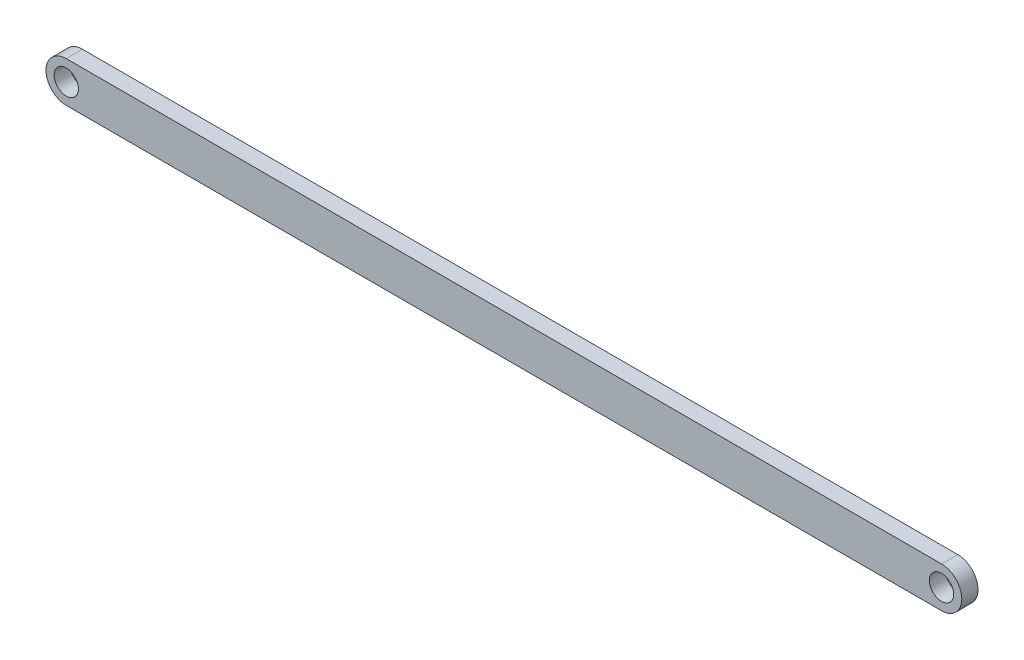
ISO-10303-21;
HEADER;
FILE_DESCRIPTION(('STEP AP214'),'2;1');
FILE_NAME('part.step','',(''),(''),'','','');
FILE_SCHEMA(('AUTOMOTIVE_DESIGN { 1 0 10303 214 1 1 1 1 }'));
ENDSEC;
DATA;
#1=APPLICATION_CONTEXT('core data for automotive mechanical design processes');
#2=APPLICATION_PROTOCOL_DEFINITION('international standard','automotive_design',2000,#1);
#3=PRODUCT_CONTEXT('',#1,'mechanical');
#4=PRODUCT('Part','Part','',(#3));
#5=PRODUCT_RELATED_PRODUCT_CATEGORY('part','',(#4));
#6=PRODUCT_DEFINITION_FORMATION('','',#4);
#7=PRODUCT_DEFINITION_CONTEXT('part definition',#1,'design');
#8=PRODUCT_DEFINITION('design','',#6,#7);
#9=PRODUCT_DEFINITION_SHAPE('','',#8);
#10=(LENGTH_UNIT() NAMED_UNIT(*) SI_UNIT(.MILLI.,.METRE.));
#11=(NAMED_UNIT(*) PLANE_ANGLE_UNIT() SI_UNIT($,.RADIAN.));
#12=(NAMED_UNIT(*) SI_UNIT($,.STERADIAN.) SOLID_ANGLE_UNIT());
#13=UNCERTAINTY_MEASURE_WITH_UNIT(LENGTH_MEASURE(1.E-05),#10,'distance_accuracy_value','');
#14=(GEOMETRIC_REPRESENTATION_CONTEXT(3) GLOBAL_UNCERTAINTY_ASSIGNED_CONTEXT((#13)) GLOBAL_UNIT_ASSIGNED_CONTEXT((#10,
#11,#12)) REPRESENTATION_CONTEXT('',''));
#15=CARTESIAN_POINT('',(0.,0.,0.));
#16=DIRECTION('',(0.,0.,1.));
#17=DIRECTION('',(1.,0.,0.));
#18=AXIS2_PLACEMENT_3D('',#15,#16,#17);
#19=CARTESIAN_POINT('',(0.,0.,2.));
#20=DIRECTION('',(0.,0.,1.));
#21=DIRECTION('',(1.,0.,0.));
#22=AXIS2_PLACEMENT_3D('',#19,#20,#21);
#23=PLANE('',#22);
#24=CARTESIAN_POINT('',(0.,0.,2.));
#25=DIRECTION('',(0.,0.,1.));
#26=DIRECTION('',(1.,0.,0.));
#27=AXIS2_PLACEMENT_3D('',#24,#25,#26);
#28=CIRCLE('',#27,1.5);
#29=CARTESIAN_POINT('',(1.5,0.,2.));
#30=VERTEX_POINT('',#29);
#31=EDGE_CURVE('E119',#30,#30,#28,.T.);
#32=ORIENTED_EDGE('',*,*,#31,.F.);
#33=EDGE_LOOP('',(#32));
#34=FACE_BOUND('',#33,.T.);
#35=CARTESIAN_POINT('',(0.,0.,2.));
#36=DIRECTION('',(0.,0.,1.));
#37=DIRECTION('',(1.,0.,0.));
#38=AXIS2_PLACEMENT_3D('',#35,#36,#37);
#39=CIRCLE('',#38,2.5);
#40=CARTESIAN_POINT('',(0.,2.5,2.));
#41=VERTEX_POINT('',#40);
#42=CARTESIAN_POINT('',(0.,-2.5,2.));
#43=VERTEX_POINT('',#42);
#44=EDGE_CURVE('E97',#41,#43,#39,.T.);
#45=ORIENTED_EDGE('',*,*,#44,.T.);
#46=DIRECTION('',(1.,0.,0.));
#47=VECTOR('',#46,1.);
#48=CARTESIAN_POINT('',(0.,-2.5,2.));
#49=LINE('',#48,#47);
#50=CARTESIAN_POINT('',(108.,-2.5,2.));
#51=VERTEX_POINT('',#50);
#52=EDGE_CURVE('E93',#43,#51,#49,.T.);
#53=ORIENTED_EDGE('',*,*,#52,.T.);
#54=CARTESIAN_POINT('',(108.,0.,2.));
#55=DIRECTION('',(0.,0.,1.));
#56=DIRECTION('',(1.,0.,0.));
#57=AXIS2_PLACEMENT_3D('',#54,#55,#56);
#58=CIRCLE('',#57,2.5);
#59=CARTESIAN_POINT('',(108.,2.5,2.));
#60=VERTEX_POINT('',#59);
#61=EDGE_CURVE('E96',#51,#60,#58,.T.);
#62=ORIENTED_EDGE('',*,*,#61,.T.);
#63=DIRECTION('',(-1.,0.,0.));
#64=VECTOR('',#63,1.);
#65=CARTESIAN_POINT('',(0.,2.5,2.));
#66=LINE('',#65,#64);
#67=EDGE_CURVE('E64',#60,#41,#66,.T.);
#68=ORIENTED_EDGE('',*,*,#67,.T.);
#69=EDGE_LOOP('',(#45,#53,#62,#68));
#70=FACE_BOUND('',#69,.T.);
#71=CARTESIAN_POINT('',(108.,0.,2.));
#72=DIRECTION('',(0.,0.,1.));
#73=DIRECTION('',(1.,0.,0.));
#74=AXIS2_PLACEMENT_3D('',#71,#72,#73);
#75=CIRCLE('',#74,1.5);
#76=CARTESIAN_POINT('',(109.5,0.,2.));
#77=VERTEX_POINT('',#76);
#78=EDGE_CURVE('E139',#77,#77,#75,.T.);
#79=ORIENTED_EDGE('',*,*,#78,.F.);
#80=EDGE_LOOP('',(#79));
#81=FACE_BOUND('',#80,.T.);
#82=ADVANCED_FACE('F44',(#34,#70,#81),#23,.T.);
#83=CARTESIAN_POINT('',(0.,0.,0.));
#84=DIRECTION('',(0.,0.,1.));
#85=DIRECTION('',(1.,0.,0.));
#86=AXIS2_PLACEMENT_3D('',#83,#84,#85);
#87=PLANE('',#86);
#88=CARTESIAN_POINT('',(0.,0.,0.));
#89=DIRECTION('',(0.,0.,1.));
#90=DIRECTION('',(1.,0.,0.));
#91=AXIS2_PLACEMENT_3D('',#88,#89,#90);
#92=CIRCLE('',#91,2.5);
#93=CARTESIAN_POINT('',(0.,2.5,0.));
#94=VERTEX_POINT('',#93);
#95=CARTESIAN_POINT('',(0.,-2.5,0.));
#96=VERTEX_POINT('',#95);
#97=EDGE_CURVE('E114',#94,#96,#92,.T.);
#98=ORIENTED_EDGE('',*,*,#97,.F.);
#99=DIRECTION('',(-1.,0.,0.));
#100=VECTOR('',#99,1.);
#101=CARTESIAN_POINT('',(0.,2.5,0.));
#102=LINE('',#101,#100);
#103=CARTESIAN_POINT('',(108.,2.5,0.));
#104=VERTEX_POINT('',#103);
#105=EDGE_CURVE('E86',#104,#94,#102,.T.);
#106=ORIENTED_EDGE('',*,*,#105,.F.);
#107=CARTESIAN_POINT('',(108.,0.,0.));
#108=DIRECTION('',(0.,0.,1.));
#109=DIRECTION('',(1.,0.,0.));
#110=AXIS2_PLACEMENT_3D('',#107,#108,#109);
#111=CIRCLE('',#110,2.5);
#112=CARTESIAN_POINT('',(108.,-2.5,0.));
#113=VERTEX_POINT('',#112);
#114=EDGE_CURVE('E79',#113,#104,#111,.T.);
#115=ORIENTED_EDGE('',*,*,#114,.F.);
#116=DIRECTION('',(1.,0.,0.));
#117=VECTOR('',#116,1.);
#118=CARTESIAN_POINT('',(0.,-2.5,0.));
#119=LINE('',#118,#117);
#120=EDGE_CURVE('E104',#96,#113,#119,.T.);
#121=ORIENTED_EDGE('',*,*,#120,.F.);
#122=EDGE_LOOP('',(#98,#106,#115,#121));
#123=FACE_BOUND('',#122,.T.);
#124=CARTESIAN_POINT('',(0.,0.,0.));
#125=DIRECTION('',(0.,0.,1.));
#126=DIRECTION('',(1.,0.,0.));
#127=AXIS2_PLACEMENT_3D('',#124,#125,#126);
#128=CIRCLE('',#127,1.5);
#129=CARTESIAN_POINT('',(1.5,0.,0.));
#130=VERTEX_POINT('',#129);
#131=EDGE_CURVE('E136',#130,#130,#128,.T.);
#132=ORIENTED_EDGE('',*,*,#131,.T.);
#133=EDGE_LOOP('',(#132));
#134=FACE_BOUND('',#133,.T.);
#135=CARTESIAN_POINT('',(108.,0.,0.));
#136=DIRECTION('',(0.,0.,1.));
#137=DIRECTION('',(1.,0.,0.));
#138=AXIS2_PLACEMENT_3D('',#135,#136,#137);
#139=CIRCLE('',#138,1.5);
#140=CARTESIAN_POINT('',(109.5,0.,0.));
#141=VERTEX_POINT('',#140);
#142=EDGE_CURVE('E143',#141,#141,#139,.T.);
#143=ORIENTED_EDGE('',*,*,#142,.T.);
#144=EDGE_LOOP('',(#143));
#145=FACE_BOUND('',#144,.T.);
#146=ADVANCED_FACE('F131',(#123,#134,#145),#87,.F.);
#147=CARTESIAN_POINT('',(0.,0.,2.));
#148=DIRECTION('',(0.,0.,-1.));
#149=DIRECTION('',(-1.,0.,0.));
#150=AXIS2_PLACEMENT_3D('',#147,#148,#149);
#151=CYLINDRICAL_SURFACE('',#150,2.5);
#152=ORIENTED_EDGE('',*,*,#97,.T.);
#153=DIRECTION('',(0.,0.,-1.));
#154=VECTOR('',#153,1.);
#155=CARTESIAN_POINT('',(0.,-2.5,2.));
#156=LINE('',#155,#154);
#157=EDGE_CURVE('E11',#43,#96,#156,.T.);
#158=ORIENTED_EDGE('',*,*,#157,.F.);
#159=ORIENTED_EDGE('',*,*,#44,.F.);
#160=DIRECTION('',(0.,0.,-1.));
#161=VECTOR('',#160,1.);
#162=CARTESIAN_POINT('',(0.,2.5,2.));
#163=LINE('',#162,#161);
#164=EDGE_CURVE('E110',#41,#94,#163,.T.);
#165=ORIENTED_EDGE('',*,*,#164,.T.);
#166=EDGE_LOOP('',(#152,#158,#159,#165));
#167=FACE_BOUND('',#166,.T.);
#168=ADVANCED_FACE('F50',(#167),#151,.T.);
#169=CARTESIAN_POINT('',(0.,-2.5,2.));
#170=DIRECTION('',(0.,1.,0.));
#171=DIRECTION('',(0.,0.,1.));
#172=AXIS2_PLACEMENT_3D('',#169,#170,#171);
#173=PLANE('',#172);
#174=ORIENTED_EDGE('',*,*,#120,.T.);
#175=DIRECTION('',(0.,0.,-1.));
#176=VECTOR('',#175,1.);
#177=CARTESIAN_POINT('',(108.,-2.5,2.));
#178=LINE('',#177,#176);
#179=EDGE_CURVE('E54',#51,#113,#178,.T.);
#180=ORIENTED_EDGE('',*,*,#179,.F.);
#181=ORIENTED_EDGE('',*,*,#52,.F.);
#182=ORIENTED_EDGE('',*,*,#157,.T.);
#183=EDGE_LOOP('',(#174,#180,#181,#182));
#184=FACE_BOUND('',#183,.T.);
#185=ADVANCED_FACE('F105',(#184),#173,.F.);
#186=CARTESIAN_POINT('',(108.,0.,2.));
#187=DIRECTION('',(0.,0.,-1.));
#188=DIRECTION('',(-1.,0.,0.));
#189=AXIS2_PLACEMENT_3D('',#186,#187,#188);
#190=CYLINDRICAL_SURFACE('',#189,2.5);
#191=ORIENTED_EDGE('',*,*,#114,.T.);
#192=DIRECTION('',(0.,0.,-1.));
#193=VECTOR('',#192,1.);
#194=CARTESIAN_POINT('',(108.,2.5,2.));
#195=LINE('',#194,#193);
#196=EDGE_CURVE('E103',#60,#104,#195,.T.);
#197=ORIENTED_EDGE('',*,*,#196,.F.);
#198=ORIENTED_EDGE('',*,*,#61,.F.);
#199=ORIENTED_EDGE('',*,*,#179,.T.);
#200=EDGE_LOOP('',(#191,#197,#198,#199));
#201=FACE_BOUND('',#200,.T.);
#202=ADVANCED_FACE('F106',(#201),#190,.T.);
#203=CARTESIAN_POINT('',(0.,2.5,2.));
#204=DIRECTION('',(0.,-1.,0.));
#205=DIRECTION('',(0.,0.,-1.));
#206=AXIS2_PLACEMENT_3D('',#203,#204,#205);
#207=PLANE('',#206);
#208=ORIENTED_EDGE('',*,*,#105,.T.);
#209=ORIENTED_EDGE('',*,*,#164,.F.);
#210=ORIENTED_EDGE('',*,*,#67,.F.);
#211=ORIENTED_EDGE('',*,*,#196,.T.);
#212=EDGE_LOOP('',(#208,#209,#210,#211));
#213=FACE_BOUND('',#212,.T.);
#214=ADVANCED_FACE('F126',(#213),#207,.F.);
#215=CARTESIAN_POINT('',(0.,0.,2.));
#216=DIRECTION('',(0.,0.,-1.));
#217=DIRECTION('',(-1.,0.,0.));
#218=AXIS2_PLACEMENT_3D('',#215,#216,#217);
#219=CYLINDRICAL_SURFACE('',#218,1.5);
#220=ORIENTED_EDGE('',*,*,#31,.T.);
#221=EDGE_LOOP('',(#220));
#222=FACE_BOUND('',#221,.T.);
#223=ORIENTED_EDGE('',*,*,#131,.F.);
#224=EDGE_LOOP('',(#223));
#225=FACE_BOUND('',#224,.T.);
#226=ADVANCED_FACE('F164',(#222,#225),#219,.F.);
#227=CARTESIAN_POINT('',(108.,0.,2.));
#228=DIRECTION('',(0.,0.,-1.));
#229=DIRECTION('',(-1.,0.,0.));
#230=AXIS2_PLACEMENT_3D('',#227,#228,#229);
#231=CYLINDRICAL_SURFACE('',#230,1.5);
#232=ORIENTED_EDGE('',*,*,#78,.T.);
#233=EDGE_LOOP('',(#232));
#234=FACE_BOUND('',#233,.T.);
#235=ORIENTED_EDGE('',*,*,#142,.F.);
#236=EDGE_LOOP('',(#235));
#237=FACE_BOUND('',#236,.T.);
#238=ADVANCED_FACE('F152',(#234,#237),#231,.F.);
#239=CLOSED_SHELL('',(#82,#146,#168,#185,#202,#214,#226,#238));
#240=MANIFOLD_SOLID_BREP('B2',#239);
#241=ADVANCED_BREP_SHAPE_REPRESENTATION('',(#18,#240),#14);
#242=SHAPE_DEFINITION_REPRESENTATION(#9,#241);
ENDSEC;
END-ISO-10303-21;
